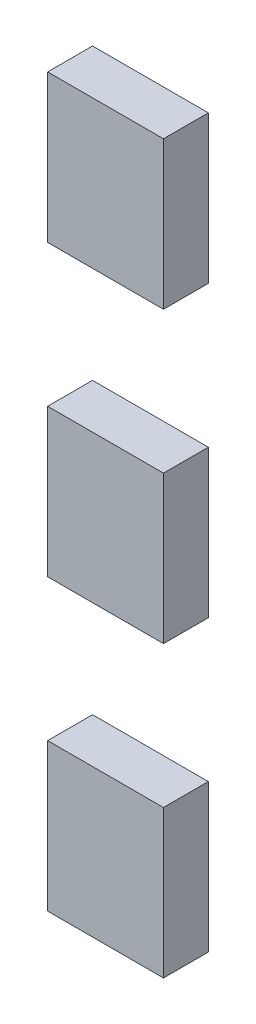
ISO-10303-21;
HEADER;
FILE_DESCRIPTION(('STEP AP214'),'2;1');
FILE_NAME('part.step','',(''),(''),'','','');
FILE_SCHEMA(('AUTOMOTIVE_DESIGN { 1 0 10303 214 1 1 1 1 }'));
ENDSEC;
DATA;
#1=APPLICATION_CONTEXT('core data for automotive mechanical design processes');
#2=APPLICATION_PROTOCOL_DEFINITION('international standard','automotive_design',2000,#1);
#3=PRODUCT_CONTEXT('',#1,'mechanical');
#4=PRODUCT('Part','Part','',(#3));
#5=PRODUCT_RELATED_PRODUCT_CATEGORY('part','',(#4));
#6=PRODUCT_DEFINITION_FORMATION('','',#4);
#7=PRODUCT_DEFINITION_CONTEXT('part definition',#1,'design');
#8=PRODUCT_DEFINITION('design','',#6,#7);
#9=PRODUCT_DEFINITION_SHAPE('','',#8);
#10=(LENGTH_UNIT() NAMED_UNIT(*) SI_UNIT(.MILLI.,.METRE.));
#11=(NAMED_UNIT(*) PLANE_ANGLE_UNIT() SI_UNIT($,.RADIAN.));
#12=(NAMED_UNIT(*) SI_UNIT($,.STERADIAN.) SOLID_ANGLE_UNIT());
#13=UNCERTAINTY_MEASURE_WITH_UNIT(LENGTH_MEASURE(1.E-05),#10,'distance_accuracy_value','');
#14=(GEOMETRIC_REPRESENTATION_CONTEXT(3) GLOBAL_UNCERTAINTY_ASSIGNED_CONTEXT((#13)) GLOBAL_UNIT_ASSIGNED_CONTEXT((#10,
#11,#12)) REPRESENTATION_CONTEXT('',''));
#15=CARTESIAN_POINT('',(0.,0.,0.));
#16=DIRECTION('',(0.,0.,1.));
#17=DIRECTION('',(1.,0.,0.));
#18=AXIS2_PLACEMENT_3D('',#15,#16,#17);
#19=CARTESIAN_POINT('',(0.6,-0.1275,0.0775));
#20=DIRECTION('',(0.,0.,1.));
#21=DIRECTION('',(1.,0.,0.));
#22=AXIS2_PLACEMENT_3D('',#19,#20,#21);
#23=PLANE('',#22);
#24=DIRECTION('',(0.,1.,0.));
#25=VECTOR('',#24,1.);
#26=CARTESIAN_POINT('',(0.8,-0.1275,0.0775));
#27=LINE('',#26,#25);
#28=CARTESIAN_POINT('',(0.8,0.1275,0.0775));
#29=VERTEX_POINT('',#28);
#30=CARTESIAN_POINT('',(0.8,-0.1275,0.0775));
#31=VERTEX_POINT('',#30);
#32=EDGE_CURVE('P0_E76',#29,#31,#27,.F.);
#33=ORIENTED_EDGE('',*,*,#32,.F.);
#34=DIRECTION('',(1.,0.,0.));
#35=VECTOR('',#34,1.);
#36=CARTESIAN_POINT('',(0.6,0.1275,0.0775));
#37=LINE('',#36,#35);
#38=CARTESIAN_POINT('',(0.6,0.1275,0.0775));
#39=VERTEX_POINT('',#38);
#40=EDGE_CURVE('P0_E58',#39,#29,#37,.T.);
#41=ORIENTED_EDGE('',*,*,#40,.F.);
#42=DIRECTION('',(0.,1.,0.));
#43=VECTOR('',#42,1.);
#44=CARTESIAN_POINT('',(0.6,-0.1275,0.0775));
#45=LINE('',#44,#43);
#46=CARTESIAN_POINT('',(0.6,-0.1275,0.0775));
#47=VERTEX_POINT('',#46);
#48=EDGE_CURVE('P0_E20',#39,#47,#45,.F.);
#49=ORIENTED_EDGE('',*,*,#48,.T.);
#50=DIRECTION('',(1.,0.,0.));
#51=VECTOR('',#50,1.);
#52=CARTESIAN_POINT('',(0.6,-0.1275,0.0775));
#53=LINE('',#52,#51);
#54=EDGE_CURVE('P0_E55',#47,#31,#53,.T.);
#55=ORIENTED_EDGE('',*,*,#54,.T.);
#56=EDGE_LOOP('',(#33,#41,#49,#55));
#57=FACE_BOUND('',#56,.T.);
#58=ADVANCED_FACE('P0_F17',(#57),#23,.T.);
#59=CARTESIAN_POINT('',(0.6,-0.1275,0.));
#60=DIRECTION('',(1.,0.,0.));
#61=DIRECTION('',(0.,0.,-1.));
#62=AXIS2_PLACEMENT_3D('',#59,#60,#61);
#63=PLANE('',#62);
#64=DIRECTION('',(0.,0.,1.));
#65=VECTOR('',#64,1.);
#66=CARTESIAN_POINT('',(0.6,0.1275,0.));
#67=LINE('',#66,#65);
#68=CARTESIAN_POINT('',(0.6,0.1275,0.));
#69=VERTEX_POINT('',#68);
#70=EDGE_CURVE('P0_E78',#69,#39,#67,.T.);
#71=ORIENTED_EDGE('',*,*,#70,.F.);
#72=DIRECTION('',(0.,1.,0.));
#73=VECTOR('',#72,1.);
#74=CARTESIAN_POINT('',(0.6,-0.1275,0.));
#75=LINE('',#74,#73);
#76=CARTESIAN_POINT('',(0.6,-0.1275,0.));
#77=VERTEX_POINT('',#76);
#78=EDGE_CURVE('P0_E73',#69,#77,#75,.F.);
#79=ORIENTED_EDGE('',*,*,#78,.T.);
#80=DIRECTION('',(0.,0.,1.));
#81=VECTOR('',#80,1.);
#82=CARTESIAN_POINT('',(0.6,-0.1275,0.));
#83=LINE('',#82,#81);
#84=EDGE_CURVE('P0_E63',#77,#47,#83,.T.);
#85=ORIENTED_EDGE('',*,*,#84,.T.);
#86=ORIENTED_EDGE('',*,*,#48,.F.);
#87=EDGE_LOOP('',(#71,#79,#85,#86));
#88=FACE_BOUND('',#87,.T.);
#89=ADVANCED_FACE('P0_F72',(#88),#63,.F.);
#90=CARTESIAN_POINT('',(0.6,-0.1275,0.));
#91=DIRECTION('',(0.,1.,0.));
#92=DIRECTION('',(0.,0.,1.));
#93=AXIS2_PLACEMENT_3D('',#90,#91,#92);
#94=PLANE('',#93);
#95=ORIENTED_EDGE('',*,*,#54,.F.);
#96=ORIENTED_EDGE('',*,*,#84,.F.);
#97=DIRECTION('',(1.,0.,0.));
#98=VECTOR('',#97,1.);
#99=CARTESIAN_POINT('',(0.6,-0.1275,0.));
#100=LINE('',#99,#98);
#101=CARTESIAN_POINT('',(0.8,-0.1275,0.));
#102=VERTEX_POINT('',#101);
#103=EDGE_CURVE('P0_E83',#77,#102,#100,.T.);
#104=ORIENTED_EDGE('',*,*,#103,.T.);
#105=DIRECTION('',(0.,0.,-1.));
#106=VECTOR('',#105,1.);
#107=CARTESIAN_POINT('',(0.8,-0.1275,0.));
#108=LINE('',#107,#106);
#109=EDGE_CURVE('P0_E69',#31,#102,#108,.T.);
#110=ORIENTED_EDGE('',*,*,#109,.F.);
#111=EDGE_LOOP('',(#95,#96,#104,#110));
#112=FACE_BOUND('',#111,.T.);
#113=ADVANCED_FACE('P0_F66',(#112),#94,.F.);
#114=CARTESIAN_POINT('',(0.8,-0.1275,0.));
#115=DIRECTION('',(1.,0.,0.));
#116=DIRECTION('',(0.,0.,-1.));
#117=AXIS2_PLACEMENT_3D('',#114,#115,#116);
#118=PLANE('',#117);
#119=DIRECTION('',(0.,0.,1.));
#120=VECTOR('',#119,1.);
#121=CARTESIAN_POINT('',(0.8,0.1275,0.));
#122=LINE('',#121,#120);
#123=CARTESIAN_POINT('',(0.8,0.1275,0.));
#124=VERTEX_POINT('',#123);
#125=EDGE_CURVE('P0_E34',#29,#124,#122,.F.);
#126=ORIENTED_EDGE('',*,*,#125,.F.);
#127=ORIENTED_EDGE('',*,*,#32,.T.);
#128=ORIENTED_EDGE('',*,*,#109,.T.);
#129=DIRECTION('',(0.,1.,0.));
#130=VECTOR('',#129,1.);
#131=CARTESIAN_POINT('',(0.8,-0.1275,0.));
#132=LINE('',#131,#130);
#133=EDGE_CURVE('P0_E26',#102,#124,#132,.T.);
#134=ORIENTED_EDGE('',*,*,#133,.T.);
#135=EDGE_LOOP('',(#126,#127,#128,#134));
#136=FACE_BOUND('',#135,.T.);
#137=ADVANCED_FACE('P0_F88',(#136),#118,.T.);
#138=CARTESIAN_POINT('',(0.6,0.1275,0.));
#139=DIRECTION('',(0.,1.,0.));
#140=DIRECTION('',(0.,0.,1.));
#141=AXIS2_PLACEMENT_3D('',#138,#139,#140);
#142=PLANE('',#141);
#143=ORIENTED_EDGE('',*,*,#40,.T.);
#144=ORIENTED_EDGE('',*,*,#125,.T.);
#145=DIRECTION('',(1.,0.,0.));
#146=VECTOR('',#145,1.);
#147=CARTESIAN_POINT('',(0.6,0.1275,0.));
#148=LINE('',#147,#146);
#149=EDGE_CURVE('P0_E11',#124,#69,#148,.F.);
#150=ORIENTED_EDGE('',*,*,#149,.T.);
#151=ORIENTED_EDGE('',*,*,#70,.T.);
#152=EDGE_LOOP('',(#143,#144,#150,#151));
#153=FACE_BOUND('',#152,.T.);
#154=ADVANCED_FACE('P0_F91',(#153),#142,.T.);
#155=CARTESIAN_POINT('',(0.6,-0.1275,0.));
#156=DIRECTION('',(0.,0.,1.));
#157=DIRECTION('',(1.,0.,0.));
#158=AXIS2_PLACEMENT_3D('',#155,#156,#157);
#159=PLANE('',#158);
#160=ORIENTED_EDGE('',*,*,#133,.F.);
#161=ORIENTED_EDGE('',*,*,#103,.F.);
#162=ORIENTED_EDGE('',*,*,#78,.F.);
#163=ORIENTED_EDGE('',*,*,#149,.F.);
#164=EDGE_LOOP('',(#160,#161,#162,#163));
#165=FACE_BOUND('',#164,.T.);
#166=ADVANCED_FACE('P0_F90',(#165),#159,.F.);
#167=CLOSED_SHELL('',(#58,#89,#113,#137,#154,#166));
#168=MANIFOLD_SOLID_BREP('P0_B1',#167);
#169=CARTESIAN_POINT('',(0.6,-0.6275,0.0775));
#170=DIRECTION('',(0.,0.,1.));
#171=DIRECTION('',(1.,0.,0.));
#172=AXIS2_PLACEMENT_3D('',#169,#170,#171);
#173=PLANE('',#172);
#174=DIRECTION('',(0.,1.,0.));
#175=VECTOR('',#174,1.);
#176=CARTESIAN_POINT('',(0.8,-0.6275,0.0775));
#177=LINE('',#176,#175);
#178=CARTESIAN_POINT('',(0.8,-0.3725,0.0775));
#179=VERTEX_POINT('',#178);
#180=CARTESIAN_POINT('',(0.8,-0.6275,0.0775));
#181=VERTEX_POINT('',#180);
#182=EDGE_CURVE('P1_E76',#179,#181,#177,.F.);
#183=ORIENTED_EDGE('',*,*,#182,.F.);
#184=DIRECTION('',(1.,0.,0.));
#185=VECTOR('',#184,1.);
#186=CARTESIAN_POINT('',(0.6,-0.3725,0.0775));
#187=LINE('',#186,#185);
#188=CARTESIAN_POINT('',(0.6,-0.3725,0.0775));
#189=VERTEX_POINT('',#188);
#190=EDGE_CURVE('P1_E58',#189,#179,#187,.T.);
#191=ORIENTED_EDGE('',*,*,#190,.F.);
#192=DIRECTION('',(0.,1.,0.));
#193=VECTOR('',#192,1.);
#194=CARTESIAN_POINT('',(0.6,-0.6275,0.0775));
#195=LINE('',#194,#193);
#196=CARTESIAN_POINT('',(0.6,-0.6275,0.0775));
#197=VERTEX_POINT('',#196);
#198=EDGE_CURVE('P1_E20',#189,#197,#195,.F.);
#199=ORIENTED_EDGE('',*,*,#198,.T.);
#200=DIRECTION('',(1.,0.,0.));
#201=VECTOR('',#200,1.);
#202=CARTESIAN_POINT('',(0.6,-0.6275,0.0775));
#203=LINE('',#202,#201);
#204=EDGE_CURVE('P1_E55',#197,#181,#203,.T.);
#205=ORIENTED_EDGE('',*,*,#204,.T.);
#206=EDGE_LOOP('',(#183,#191,#199,#205));
#207=FACE_BOUND('',#206,.T.);
#208=ADVANCED_FACE('P1_F17',(#207),#173,.T.);
#209=CARTESIAN_POINT('',(0.6,-0.6275,0.));
#210=DIRECTION('',(1.,0.,0.));
#211=DIRECTION('',(0.,0.,-1.));
#212=AXIS2_PLACEMENT_3D('',#209,#210,#211);
#213=PLANE('',#212);
#214=DIRECTION('',(0.,0.,1.));
#215=VECTOR('',#214,1.);
#216=CARTESIAN_POINT('',(0.6,-0.3725,0.));
#217=LINE('',#216,#215);
#218=CARTESIAN_POINT('',(0.6,-0.3725,0.));
#219=VERTEX_POINT('',#218);
#220=EDGE_CURVE('P1_E78',#219,#189,#217,.T.);
#221=ORIENTED_EDGE('',*,*,#220,.F.);
#222=DIRECTION('',(0.,1.,0.));
#223=VECTOR('',#222,1.);
#224=CARTESIAN_POINT('',(0.6,-0.6275,0.));
#225=LINE('',#224,#223);
#226=CARTESIAN_POINT('',(0.6,-0.6275,0.));
#227=VERTEX_POINT('',#226);
#228=EDGE_CURVE('P1_E73',#219,#227,#225,.F.);
#229=ORIENTED_EDGE('',*,*,#228,.T.);
#230=DIRECTION('',(0.,0.,1.));
#231=VECTOR('',#230,1.);
#232=CARTESIAN_POINT('',(0.6,-0.6275,0.));
#233=LINE('',#232,#231);
#234=EDGE_CURVE('P1_E63',#227,#197,#233,.T.);
#235=ORIENTED_EDGE('',*,*,#234,.T.);
#236=ORIENTED_EDGE('',*,*,#198,.F.);
#237=EDGE_LOOP('',(#221,#229,#235,#236));
#238=FACE_BOUND('',#237,.T.);
#239=ADVANCED_FACE('P1_F72',(#238),#213,.F.);
#240=CARTESIAN_POINT('',(0.6,-0.6275,0.));
#241=DIRECTION('',(0.,1.,0.));
#242=DIRECTION('',(0.,0.,1.));
#243=AXIS2_PLACEMENT_3D('',#240,#241,#242);
#244=PLANE('',#243);
#245=ORIENTED_EDGE('',*,*,#204,.F.);
#246=ORIENTED_EDGE('',*,*,#234,.F.);
#247=DIRECTION('',(1.,0.,0.));
#248=VECTOR('',#247,1.);
#249=CARTESIAN_POINT('',(0.6,-0.6275,0.));
#250=LINE('',#249,#248);
#251=CARTESIAN_POINT('',(0.8,-0.6275,0.));
#252=VERTEX_POINT('',#251);
#253=EDGE_CURVE('P1_E83',#227,#252,#250,.T.);
#254=ORIENTED_EDGE('',*,*,#253,.T.);
#255=DIRECTION('',(0.,0.,-1.));
#256=VECTOR('',#255,1.);
#257=CARTESIAN_POINT('',(0.8,-0.6275,0.));
#258=LINE('',#257,#256);
#259=EDGE_CURVE('P1_E69',#181,#252,#258,.T.);
#260=ORIENTED_EDGE('',*,*,#259,.F.);
#261=EDGE_LOOP('',(#245,#246,#254,#260));
#262=FACE_BOUND('',#261,.T.);
#263=ADVANCED_FACE('P1_F66',(#262),#244,.F.);
#264=CARTESIAN_POINT('',(0.8,-0.6275,0.));
#265=DIRECTION('',(1.,0.,0.));
#266=DIRECTION('',(0.,0.,-1.));
#267=AXIS2_PLACEMENT_3D('',#264,#265,#266);
#268=PLANE('',#267);
#269=DIRECTION('',(0.,0.,1.));
#270=VECTOR('',#269,1.);
#271=CARTESIAN_POINT('',(0.8,-0.3725,0.));
#272=LINE('',#271,#270);
#273=CARTESIAN_POINT('',(0.8,-0.3725,0.));
#274=VERTEX_POINT('',#273);
#275=EDGE_CURVE('P1_E34',#179,#274,#272,.F.);
#276=ORIENTED_EDGE('',*,*,#275,.F.);
#277=ORIENTED_EDGE('',*,*,#182,.T.);
#278=ORIENTED_EDGE('',*,*,#259,.T.);
#279=DIRECTION('',(0.,1.,0.));
#280=VECTOR('',#279,1.);
#281=CARTESIAN_POINT('',(0.8,-0.6275,0.));
#282=LINE('',#281,#280);
#283=EDGE_CURVE('P1_E26',#252,#274,#282,.T.);
#284=ORIENTED_EDGE('',*,*,#283,.T.);
#285=EDGE_LOOP('',(#276,#277,#278,#284));
#286=FACE_BOUND('',#285,.T.);
#287=ADVANCED_FACE('P1_F88',(#286),#268,.T.);
#288=CARTESIAN_POINT('',(0.6,-0.3725,0.));
#289=DIRECTION('',(0.,1.,0.));
#290=DIRECTION('',(0.,0.,1.));
#291=AXIS2_PLACEMENT_3D('',#288,#289,#290);
#292=PLANE('',#291);
#293=ORIENTED_EDGE('',*,*,#190,.T.);
#294=ORIENTED_EDGE('',*,*,#275,.T.);
#295=DIRECTION('',(1.,0.,0.));
#296=VECTOR('',#295,1.);
#297=CARTESIAN_POINT('',(0.6,-0.3725,0.));
#298=LINE('',#297,#296);
#299=EDGE_CURVE('P1_E11',#274,#219,#298,.F.);
#300=ORIENTED_EDGE('',*,*,#299,.T.);
#301=ORIENTED_EDGE('',*,*,#220,.T.);
#302=EDGE_LOOP('',(#293,#294,#300,#301));
#303=FACE_BOUND('',#302,.T.);
#304=ADVANCED_FACE('P1_F91',(#303),#292,.T.);
#305=CARTESIAN_POINT('',(0.6,-0.6275,0.));
#306=DIRECTION('',(0.,0.,1.));
#307=DIRECTION('',(1.,0.,0.));
#308=AXIS2_PLACEMENT_3D('',#305,#306,#307);
#309=PLANE('',#308);
#310=ORIENTED_EDGE('',*,*,#283,.F.);
#311=ORIENTED_EDGE('',*,*,#253,.F.);
#312=ORIENTED_EDGE('',*,*,#228,.F.);
#313=ORIENTED_EDGE('',*,*,#299,.F.);
#314=EDGE_LOOP('',(#310,#311,#312,#313));
#315=FACE_BOUND('',#314,.T.);
#316=ADVANCED_FACE('P1_F90',(#315),#309,.F.);
#317=CLOSED_SHELL('',(#208,#239,#263,#287,#304,#316));
#318=MANIFOLD_SOLID_BREP('P1_B1',#317);
#319=CARTESIAN_POINT('',(0.6,0.3725,0.0775));
#320=DIRECTION('',(0.,0.,1.));
#321=DIRECTION('',(1.,0.,0.));
#322=AXIS2_PLACEMENT_3D('',#319,#320,#321);
#323=PLANE('',#322);
#324=DIRECTION('',(0.,1.,0.));
#325=VECTOR('',#324,1.);
#326=CARTESIAN_POINT('',(0.8,0.3725,0.0775));
#327=LINE('',#326,#325);
#328=CARTESIAN_POINT('',(0.8,0.6275,0.0775));
#329=VERTEX_POINT('',#328);
#330=CARTESIAN_POINT('',(0.8,0.3725,0.0775));
#331=VERTEX_POINT('',#330);
#332=EDGE_CURVE('P2_E76',#329,#331,#327,.F.);
#333=ORIENTED_EDGE('',*,*,#332,.F.);
#334=DIRECTION('',(1.,0.,0.));
#335=VECTOR('',#334,1.);
#336=CARTESIAN_POINT('',(0.6,0.6275,0.0775));
#337=LINE('',#336,#335);
#338=CARTESIAN_POINT('',(0.6,0.6275,0.0775));
#339=VERTEX_POINT('',#338);
#340=EDGE_CURVE('P2_E58',#339,#329,#337,.T.);
#341=ORIENTED_EDGE('',*,*,#340,.F.);
#342=DIRECTION('',(0.,1.,0.));
#343=VECTOR('',#342,1.);
#344=CARTESIAN_POINT('',(0.6,0.3725,0.0775));
#345=LINE('',#344,#343);
#346=CARTESIAN_POINT('',(0.6,0.3725,0.0775));
#347=VERTEX_POINT('',#346);
#348=EDGE_CURVE('P2_E20',#339,#347,#345,.F.);
#349=ORIENTED_EDGE('',*,*,#348,.T.);
#350=DIRECTION('',(1.,0.,0.));
#351=VECTOR('',#350,1.);
#352=CARTESIAN_POINT('',(0.6,0.3725,0.0775));
#353=LINE('',#352,#351);
#354=EDGE_CURVE('P2_E55',#347,#331,#353,.T.);
#355=ORIENTED_EDGE('',*,*,#354,.T.);
#356=EDGE_LOOP('',(#333,#341,#349,#355));
#357=FACE_BOUND('',#356,.T.);
#358=ADVANCED_FACE('P2_F17',(#357),#323,.T.);
#359=CARTESIAN_POINT('',(0.6,0.3725,0.));
#360=DIRECTION('',(1.,0.,0.));
#361=DIRECTION('',(0.,0.,-1.));
#362=AXIS2_PLACEMENT_3D('',#359,#360,#361);
#363=PLANE('',#362);
#364=DIRECTION('',(0.,0.,1.));
#365=VECTOR('',#364,1.);
#366=CARTESIAN_POINT('',(0.6,0.6275,0.));
#367=LINE('',#366,#365);
#368=CARTESIAN_POINT('',(0.6,0.6275,0.));
#369=VERTEX_POINT('',#368);
#370=EDGE_CURVE('P2_E78',#369,#339,#367,.T.);
#371=ORIENTED_EDGE('',*,*,#370,.F.);
#372=DIRECTION('',(0.,1.,0.));
#373=VECTOR('',#372,1.);
#374=CARTESIAN_POINT('',(0.6,0.3725,0.));
#375=LINE('',#374,#373);
#376=CARTESIAN_POINT('',(0.6,0.3725,0.));
#377=VERTEX_POINT('',#376);
#378=EDGE_CURVE('P2_E73',#369,#377,#375,.F.);
#379=ORIENTED_EDGE('',*,*,#378,.T.);
#380=DIRECTION('',(0.,0.,1.));
#381=VECTOR('',#380,1.);
#382=CARTESIAN_POINT('',(0.6,0.3725,0.));
#383=LINE('',#382,#381);
#384=EDGE_CURVE('P2_E63',#377,#347,#383,.T.);
#385=ORIENTED_EDGE('',*,*,#384,.T.);
#386=ORIENTED_EDGE('',*,*,#348,.F.);
#387=EDGE_LOOP('',(#371,#379,#385,#386));
#388=FACE_BOUND('',#387,.T.);
#389=ADVANCED_FACE('P2_F72',(#388),#363,.F.);
#390=CARTESIAN_POINT('',(0.6,0.3725,0.));
#391=DIRECTION('',(0.,1.,0.));
#392=DIRECTION('',(0.,0.,1.));
#393=AXIS2_PLACEMENT_3D('',#390,#391,#392);
#394=PLANE('',#393);
#395=ORIENTED_EDGE('',*,*,#354,.F.);
#396=ORIENTED_EDGE('',*,*,#384,.F.);
#397=DIRECTION('',(1.,0.,0.));
#398=VECTOR('',#397,1.);
#399=CARTESIAN_POINT('',(0.6,0.3725,0.));
#400=LINE('',#399,#398);
#401=CARTESIAN_POINT('',(0.8,0.3725,0.));
#402=VERTEX_POINT('',#401);
#403=EDGE_CURVE('P2_E83',#377,#402,#400,.T.);
#404=ORIENTED_EDGE('',*,*,#403,.T.);
#405=DIRECTION('',(0.,0.,-1.));
#406=VECTOR('',#405,1.);
#407=CARTESIAN_POINT('',(0.8,0.3725,0.));
#408=LINE('',#407,#406);
#409=EDGE_CURVE('P2_E69',#331,#402,#408,.T.);
#410=ORIENTED_EDGE('',*,*,#409,.F.);
#411=EDGE_LOOP('',(#395,#396,#404,#410));
#412=FACE_BOUND('',#411,.T.);
#413=ADVANCED_FACE('P2_F66',(#412),#394,.F.);
#414=CARTESIAN_POINT('',(0.8,0.3725,0.));
#415=DIRECTION('',(1.,0.,0.));
#416=DIRECTION('',(0.,0.,-1.));
#417=AXIS2_PLACEMENT_3D('',#414,#415,#416);
#418=PLANE('',#417);
#419=DIRECTION('',(0.,0.,1.));
#420=VECTOR('',#419,1.);
#421=CARTESIAN_POINT('',(0.8,0.6275,0.));
#422=LINE('',#421,#420);
#423=CARTESIAN_POINT('',(0.8,0.6275,0.));
#424=VERTEX_POINT('',#423);
#425=EDGE_CURVE('P2_E34',#329,#424,#422,.F.);
#426=ORIENTED_EDGE('',*,*,#425,.F.);
#427=ORIENTED_EDGE('',*,*,#332,.T.);
#428=ORIENTED_EDGE('',*,*,#409,.T.);
#429=DIRECTION('',(0.,1.,0.));
#430=VECTOR('',#429,1.);
#431=CARTESIAN_POINT('',(0.8,0.3725,0.));
#432=LINE('',#431,#430);
#433=EDGE_CURVE('P2_E26',#402,#424,#432,.T.);
#434=ORIENTED_EDGE('',*,*,#433,.T.);
#435=EDGE_LOOP('',(#426,#427,#428,#434));
#436=FACE_BOUND('',#435,.T.);
#437=ADVANCED_FACE('P2_F88',(#436),#418,.T.);
#438=CARTESIAN_POINT('',(0.6,0.6275,0.));
#439=DIRECTION('',(0.,1.,0.));
#440=DIRECTION('',(0.,0.,1.));
#441=AXIS2_PLACEMENT_3D('',#438,#439,#440);
#442=PLANE('',#441);
#443=ORIENTED_EDGE('',*,*,#340,.T.);
#444=ORIENTED_EDGE('',*,*,#425,.T.);
#445=DIRECTION('',(1.,0.,0.));
#446=VECTOR('',#445,1.);
#447=CARTESIAN_POINT('',(0.6,0.6275,0.));
#448=LINE('',#447,#446);
#449=EDGE_CURVE('P2_E11',#424,#369,#448,.F.);
#450=ORIENTED_EDGE('',*,*,#449,.T.);
#451=ORIENTED_EDGE('',*,*,#370,.T.);
#452=EDGE_LOOP('',(#443,#444,#450,#451));
#453=FACE_BOUND('',#452,.T.);
#454=ADVANCED_FACE('P2_F91',(#453),#442,.T.);
#455=CARTESIAN_POINT('',(0.6,0.3725,0.));
#456=DIRECTION('',(0.,0.,1.));
#457=DIRECTION('',(1.,0.,0.));
#458=AXIS2_PLACEMENT_3D('',#455,#456,#457);
#459=PLANE('',#458);
#460=ORIENTED_EDGE('',*,*,#433,.F.);
#461=ORIENTED_EDGE('',*,*,#403,.F.);
#462=ORIENTED_EDGE('',*,*,#378,.F.);
#463=ORIENTED_EDGE('',*,*,#449,.F.);
#464=EDGE_LOOP('',(#460,#461,#462,#463));
#465=FACE_BOUND('',#464,.T.);
#466=ADVANCED_FACE('P2_F90',(#465),#459,.F.);
#467=CLOSED_SHELL('',(#358,#389,#413,#437,#454,#466));
#468=MANIFOLD_SOLID_BREP('P2_B1',#467);
#469=ADVANCED_BREP_SHAPE_REPRESENTATION('',(#18,#168,#318,#468),#14);
#470=SHAPE_DEFINITION_REPRESENTATION(#9,#469);
ENDSEC;
END-ISO-10303-21;
